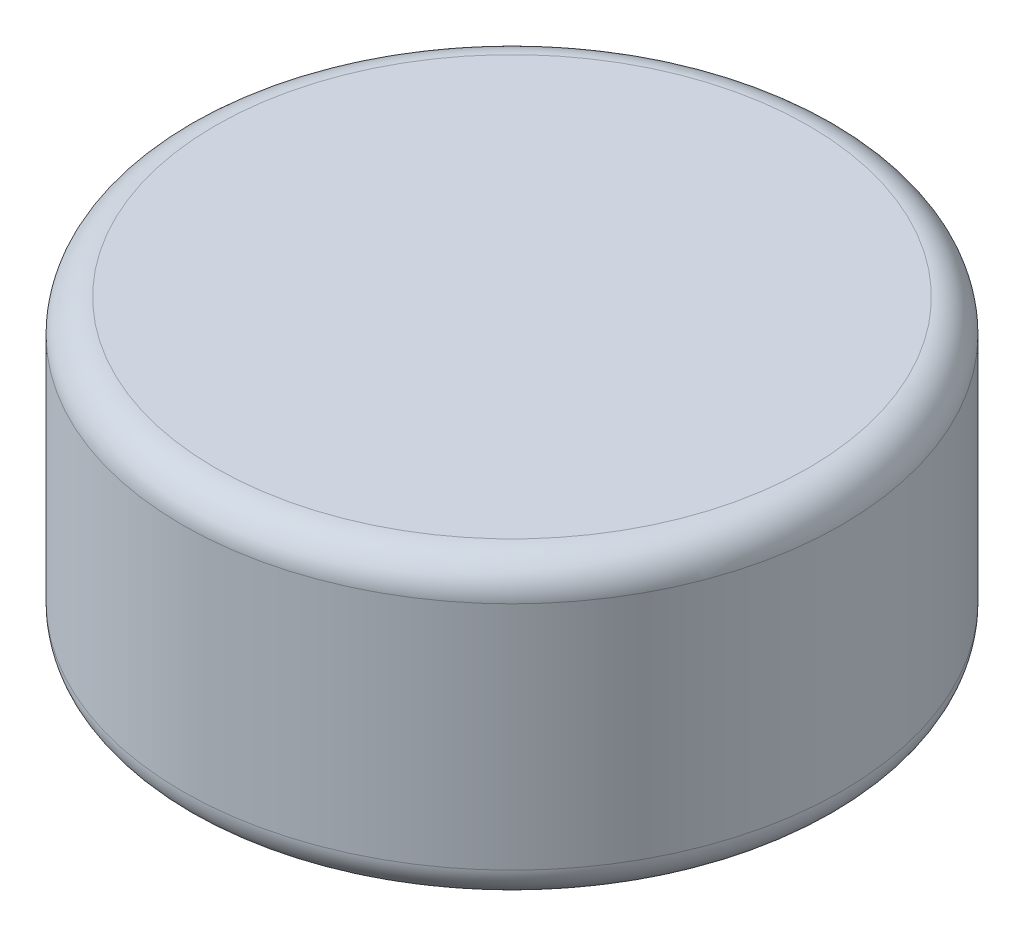
ISO-10303-21;
HEADER;
FILE_DESCRIPTION(('STEP AP214'),'2;1');
FILE_NAME('part.step','',(''),(''),'','','');
FILE_SCHEMA(('AUTOMOTIVE_DESIGN { 1 0 10303 214 1 1 1 1 }'));
ENDSEC;
DATA;
#1=APPLICATION_CONTEXT('core data for automotive mechanical design processes');
#2=APPLICATION_PROTOCOL_DEFINITION('international standard','automotive_design',2000,#1);
#3=PRODUCT_CONTEXT('',#1,'mechanical');
#4=PRODUCT('Part','Part','',(#3));
#5=PRODUCT_RELATED_PRODUCT_CATEGORY('part','',(#4));
#6=PRODUCT_DEFINITION_FORMATION('','',#4);
#7=PRODUCT_DEFINITION_CONTEXT('part definition',#1,'design');
#8=PRODUCT_DEFINITION('design','',#6,#7);
#9=PRODUCT_DEFINITION_SHAPE('','',#8);
#10=(LENGTH_UNIT() NAMED_UNIT(*) SI_UNIT(.MILLI.,.METRE.));
#11=(NAMED_UNIT(*) PLANE_ANGLE_UNIT() SI_UNIT($,.RADIAN.));
#12=(NAMED_UNIT(*) SI_UNIT($,.STERADIAN.) SOLID_ANGLE_UNIT());
#13=UNCERTAINTY_MEASURE_WITH_UNIT(LENGTH_MEASURE(1.E-05),#10,'distance_accuracy_value','');
#14=(GEOMETRIC_REPRESENTATION_CONTEXT(3) GLOBAL_UNCERTAINTY_ASSIGNED_CONTEXT((#13)) GLOBAL_UNIT_ASSIGNED_CONTEXT((#10,
#11,#12)) REPRESENTATION_CONTEXT('',''));
#15=CARTESIAN_POINT('',(0.,0.,0.));
#16=DIRECTION('',(0.,0.,1.));
#17=DIRECTION('',(1.,0.,0.));
#18=AXIS2_PLACEMENT_3D('',#15,#16,#17);
#19=CARTESIAN_POINT('',(0.,1.8,0.));
#20=DIRECTION('',(0.,-1.,0.));
#21=DIRECTION('',(0.,0.,-1.));
#22=AXIS2_PLACEMENT_3D('',#19,#20,#21);
#23=CYLINDRICAL_SURFACE('',#22,2.);
#24=CARTESIAN_POINT('',(0.,0.2,0.));
#25=DIRECTION('',(0.,1.,0.));
#26=DIRECTION('',(0.,0.,1.));
#27=AXIS2_PLACEMENT_3D('',#24,#25,#26);
#28=CIRCLE('',#27,2.);
#29=CARTESIAN_POINT('',(0.,0.2,2.));
#30=VERTEX_POINT('',#29);
#31=EDGE_CURVE('E48',#30,#30,#28,.T.);
#32=ORIENTED_EDGE('',*,*,#31,.T.);
#33=EDGE_LOOP('',(#32));
#34=FACE_BOUND('',#33,.T.);
#35=CARTESIAN_POINT('',(0.,1.6,0.));
#36=DIRECTION('',(0.,1.,0.));
#37=DIRECTION('',(0.,0.,1.));
#38=AXIS2_PLACEMENT_3D('',#35,#36,#37);
#39=CIRCLE('',#38,2.);
#40=CARTESIAN_POINT('',(0.,1.6,2.));
#41=VERTEX_POINT('',#40);
#42=EDGE_CURVE('E52',#41,#41,#39,.F.);
#43=ORIENTED_EDGE('',*,*,#42,.T.);
#44=EDGE_LOOP('',(#43));
#45=FACE_BOUND('',#44,.T.);
#46=ADVANCED_FACE('F37',(#34,#45),#23,.T.);
#47=CARTESIAN_POINT('',(0.,1.8,0.));
#48=DIRECTION('',(0.,1.,0.));
#49=DIRECTION('',(0.,0.,1.));
#50=AXIS2_PLACEMENT_3D('',#47,#48,#49);
#51=PLANE('',#50);
#52=CARTESIAN_POINT('',(0.,1.8,0.));
#53=DIRECTION('',(0.,1.,0.));
#54=DIRECTION('',(0.,0.,1.));
#55=AXIS2_PLACEMENT_3D('',#52,#53,#54);
#56=CIRCLE('',#55,1.8);
#57=CARTESIAN_POINT('',(0.,1.8,1.8));
#58=VERTEX_POINT('',#57);
#59=EDGE_CURVE('E10',#58,#58,#56,.T.);
#60=ORIENTED_EDGE('',*,*,#59,.T.);
#61=EDGE_LOOP('',(#60));
#62=FACE_BOUND('',#61,.T.);
#63=ADVANCED_FACE('F68',(#62),#51,.T.);
#64=CARTESIAN_POINT('',(0.,0.,0.));
#65=DIRECTION('',(0.,1.,0.));
#66=DIRECTION('',(0.,0.,1.));
#67=AXIS2_PLACEMENT_3D('',#64,#65,#66);
#68=PLANE('',#67);
#69=CARTESIAN_POINT('',(0.,0.,0.));
#70=DIRECTION('',(0.,1.,0.));
#71=DIRECTION('',(0.,0.,1.));
#72=AXIS2_PLACEMENT_3D('',#69,#70,#71);
#73=CIRCLE('',#72,1.8);
#74=CARTESIAN_POINT('',(0.,0.,1.8));
#75=VERTEX_POINT('',#74);
#76=EDGE_CURVE('E44',#75,#75,#73,.F.);
#77=ORIENTED_EDGE('',*,*,#76,.T.);
#78=EDGE_LOOP('',(#77));
#79=FACE_BOUND('',#78,.T.);
#80=ADVANCED_FACE('F65',(#79),#68,.F.);
#81=CARTESIAN_POINT('',(0.,0.2,0.));
#82=DIRECTION('',(0.,1.,0.));
#83=DIRECTION('',(0.,0.,1.));
#84=AXIS2_PLACEMENT_3D('',#81,#82,#83);
#85=TOROIDAL_SURFACE('',#84,1.8,0.2);
#86=ORIENTED_EDGE('',*,*,#76,.F.);
#87=EDGE_LOOP('',(#86));
#88=FACE_BOUND('',#87,.T.);
#89=ORIENTED_EDGE('',*,*,#31,.F.);
#90=EDGE_LOOP('',(#89));
#91=FACE_BOUND('',#90,.T.);
#92=ADVANCED_FACE('F61',(#88,#91),#85,.T.);
#93=CARTESIAN_POINT('',(0.,1.6,0.));
#94=DIRECTION('',(0.,1.,0.));
#95=DIRECTION('',(0.,0.,1.));
#96=AXIS2_PLACEMENT_3D('',#93,#94,#95);
#97=TOROIDAL_SURFACE('',#96,1.8,0.2);
#98=ORIENTED_EDGE('',*,*,#42,.F.);
#99=EDGE_LOOP('',(#98));
#100=FACE_BOUND('',#99,.T.);
#101=ORIENTED_EDGE('',*,*,#59,.F.);
#102=EDGE_LOOP('',(#101));
#103=FACE_BOUND('',#102,.T.);
#104=ADVANCED_FACE('F39',(#100,#103),#97,.T.);
#105=CLOSED_SHELL('',(#46,#63,#80,#92,#104));
#106=MANIFOLD_SOLID_BREP('B2',#105);
#107=ADVANCED_BREP_SHAPE_REPRESENTATION('',(#18,#106),#14);
#108=SHAPE_DEFINITION_REPRESENTATION(#9,#107);
ENDSEC;
END-ISO-10303-21;
